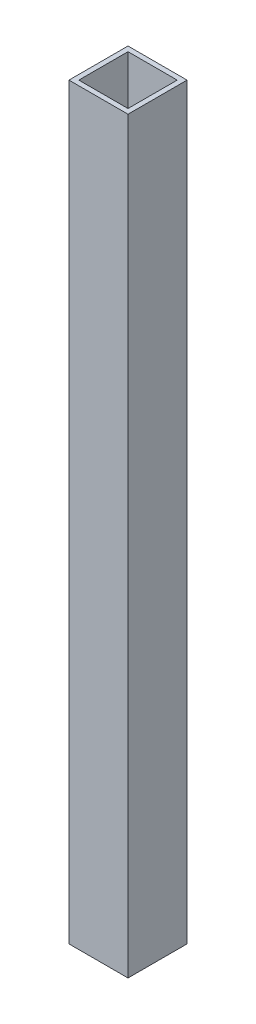
ISO-10303-21;
HEADER;
FILE_DESCRIPTION(('STEP AP214'),'2;1');
FILE_NAME('part.step','',(''),(''),'','','');
FILE_SCHEMA(('AUTOMOTIVE_DESIGN { 1 0 10303 214 1 1 1 1 }'));
ENDSEC;
DATA;
#1=APPLICATION_CONTEXT('core data for automotive mechanical design processes');
#2=APPLICATION_PROTOCOL_DEFINITION('international standard','automotive_design',2000,#1);
#3=PRODUCT_CONTEXT('',#1,'mechanical');
#4=PRODUCT('Part','Part','',(#3));
#5=PRODUCT_RELATED_PRODUCT_CATEGORY('part','',(#4));
#6=PRODUCT_DEFINITION_FORMATION('','',#4);
#7=PRODUCT_DEFINITION_CONTEXT('part definition',#1,'design');
#8=PRODUCT_DEFINITION('design','',#6,#7);
#9=PRODUCT_DEFINITION_SHAPE('','',#8);
#10=(LENGTH_UNIT() NAMED_UNIT(*) SI_UNIT(.MILLI.,.METRE.));
#11=(NAMED_UNIT(*) PLANE_ANGLE_UNIT() SI_UNIT($,.RADIAN.));
#12=(NAMED_UNIT(*) SI_UNIT($,.STERADIAN.) SOLID_ANGLE_UNIT());
#13=UNCERTAINTY_MEASURE_WITH_UNIT(LENGTH_MEASURE(1.E-05),#10,'distance_accuracy_value','');
#14=(GEOMETRIC_REPRESENTATION_CONTEXT(3) GLOBAL_UNCERTAINTY_ASSIGNED_CONTEXT((#13)) GLOBAL_UNIT_ASSIGNED_CONTEXT((#10,
#11,#12)) REPRESENTATION_CONTEXT('',''));
#15=CARTESIAN_POINT('',(0.,0.,0.));
#16=DIRECTION('',(0.,0.,1.));
#17=DIRECTION('',(1.,0.,0.));
#18=AXIS2_PLACEMENT_3D('',#15,#16,#17);
#19=CARTESIAN_POINT('',(0.,241.3,0.));
#20=DIRECTION('',(0.,-1.,0.));
#21=DIRECTION('',(0.,0.,-1.));
#22=AXIS2_PLACEMENT_3D('',#19,#20,#21);
#23=PLANE('',#22);
#24=DIRECTION('',(0.,0.,1.));
#25=VECTOR('',#24,1.);
#26=CARTESIAN_POINT('',(0.,241.3,0.));
#27=LINE('',#26,#25);
#28=CARTESIAN_POINT('',(0.,241.3,-19.05));
#29=VERTEX_POINT('',#28);
#30=CARTESIAN_POINT('',(0.,241.3,0.));
#31=VERTEX_POINT('',#30);
#32=EDGE_CURVE('E134',#29,#31,#27,.T.);
#33=ORIENTED_EDGE('',*,*,#32,.T.);
#34=DIRECTION('',(1.,0.,0.));
#35=VECTOR('',#34,1.);
#36=CARTESIAN_POINT('',(0.,241.3,0.));
#37=LINE('',#36,#35);
#38=CARTESIAN_POINT('',(19.05,241.3,0.));
#39=VERTEX_POINT('',#38);
#40=EDGE_CURVE('E137',#31,#39,#37,.T.);
#41=ORIENTED_EDGE('',*,*,#40,.T.);
#42=DIRECTION('',(0.,0.,-1.));
#43=VECTOR('',#42,1.);
#44=CARTESIAN_POINT('',(19.05,241.3,0.));
#45=LINE('',#44,#43);
#46=CARTESIAN_POINT('',(19.05,241.3,-19.05));
#47=VERTEX_POINT('',#46);
#48=EDGE_CURVE('E140',#39,#47,#45,.T.);
#49=ORIENTED_EDGE('',*,*,#48,.T.);
#50=DIRECTION('',(-1.,0.,0.));
#51=VECTOR('',#50,1.);
#52=CARTESIAN_POINT('',(0.,241.3,-19.05));
#53=LINE('',#52,#51);
#54=EDGE_CURVE('E142',#47,#29,#53,.T.);
#55=ORIENTED_EDGE('',*,*,#54,.T.);
#56=EDGE_LOOP('',(#33,#41,#49,#55));
#57=FACE_BOUND('',#56,.T.);
#58=DIRECTION('',(0.,0.,-1.));
#59=VECTOR('',#58,1.);
#60=CARTESIAN_POINT('',(17.4625,241.3,-1.5875));
#61=LINE('',#60,#59);
#62=CARTESIAN_POINT('',(17.4625,241.3,-1.5875));
#63=VERTEX_POINT('',#62);
#64=CARTESIAN_POINT('',(17.4625,241.3,-17.4625));
#65=VERTEX_POINT('',#64);
#66=EDGE_CURVE('E98',#63,#65,#61,.T.);
#67=ORIENTED_EDGE('',*,*,#66,.F.);
#68=DIRECTION('',(1.,0.,0.));
#69=VECTOR('',#68,1.);
#70=CARTESIAN_POINT('',(1.5875,241.3,-1.5875));
#71=LINE('',#70,#69);
#72=CARTESIAN_POINT('',(1.5875,241.3,-1.5875));
#73=VERTEX_POINT('',#72);
#74=EDGE_CURVE('E120',#73,#63,#71,.T.);
#75=ORIENTED_EDGE('',*,*,#74,.F.);
#76=DIRECTION('',(0.,0.,1.));
#77=VECTOR('',#76,1.);
#78=CARTESIAN_POINT('',(1.5875,241.3,-1.5875));
#79=LINE('',#78,#77);
#80=CARTESIAN_POINT('',(1.5875,241.3,-17.4625));
#81=VERTEX_POINT('',#80);
#82=EDGE_CURVE('E118',#81,#73,#79,.T.);
#83=ORIENTED_EDGE('',*,*,#82,.F.);
#84=DIRECTION('',(-1.,0.,0.));
#85=VECTOR('',#84,1.);
#86=CARTESIAN_POINT('',(1.5875,241.3,-17.4625));
#87=LINE('',#86,#85);
#88=EDGE_CURVE('E106',#65,#81,#87,.T.);
#89=ORIENTED_EDGE('',*,*,#88,.F.);
#90=EDGE_LOOP('',(#67,#75,#83,#89));
#91=FACE_BOUND('',#90,.T.);
#92=ADVANCED_FACE('F33',(#57,#91),#23,.F.);
#93=CARTESIAN_POINT('',(0.,0.,0.));
#94=DIRECTION('',(0.,-1.,0.));
#95=DIRECTION('',(0.,0.,-1.));
#96=AXIS2_PLACEMENT_3D('',#93,#94,#95);
#97=PLANE('',#96);
#98=DIRECTION('',(0.,0.,1.));
#99=VECTOR('',#98,1.);
#100=CARTESIAN_POINT('',(0.,0.,0.));
#101=LINE('',#100,#99);
#102=CARTESIAN_POINT('',(0.,0.,-19.05));
#103=VERTEX_POINT('',#102);
#104=CARTESIAN_POINT('',(0.,0.,0.));
#105=VERTEX_POINT('',#104);
#106=EDGE_CURVE('E114',#103,#105,#101,.T.);
#107=ORIENTED_EDGE('',*,*,#106,.F.);
#108=DIRECTION('',(-1.,0.,0.));
#109=VECTOR('',#108,1.);
#110=CARTESIAN_POINT('',(0.,0.,-19.05));
#111=LINE('',#110,#109);
#112=CARTESIAN_POINT('',(19.05,0.,-19.05));
#113=VERTEX_POINT('',#112);
#114=EDGE_CURVE('E138',#113,#103,#111,.T.);
#115=ORIENTED_EDGE('',*,*,#114,.F.);
#116=DIRECTION('',(0.,0.,-1.));
#117=VECTOR('',#116,1.);
#118=CARTESIAN_POINT('',(19.05,0.,0.));
#119=LINE('',#118,#117);
#120=CARTESIAN_POINT('',(19.05,0.,0.));
#121=VERTEX_POINT('',#120);
#122=EDGE_CURVE('E149',#121,#113,#119,.T.);
#123=ORIENTED_EDGE('',*,*,#122,.F.);
#124=DIRECTION('',(1.,0.,0.));
#125=VECTOR('',#124,1.);
#126=CARTESIAN_POINT('',(0.,0.,0.));
#127=LINE('',#126,#125);
#128=EDGE_CURVE('E147',#105,#121,#127,.T.);
#129=ORIENTED_EDGE('',*,*,#128,.F.);
#130=EDGE_LOOP('',(#107,#115,#123,#129));
#131=FACE_BOUND('',#130,.T.);
#132=DIRECTION('',(1.,0.,0.));
#133=VECTOR('',#132,1.);
#134=CARTESIAN_POINT('',(1.5875,0.,-1.5875));
#135=LINE('',#134,#133);
#136=CARTESIAN_POINT('',(1.5875,0.,-1.5875));
#137=VERTEX_POINT('',#136);
#138=CARTESIAN_POINT('',(17.4625,0.,-1.5875));
#139=VERTEX_POINT('',#138);
#140=EDGE_CURVE('E107',#137,#139,#135,.T.);
#141=ORIENTED_EDGE('',*,*,#140,.T.);
#142=DIRECTION('',(0.,0.,-1.));
#143=VECTOR('',#142,1.);
#144=CARTESIAN_POINT('',(17.4625,0.,-1.5875));
#145=LINE('',#144,#143);
#146=CARTESIAN_POINT('',(17.4625,0.,-17.4625));
#147=VERTEX_POINT('',#146);
#148=EDGE_CURVE('E56',#139,#147,#145,.T.);
#149=ORIENTED_EDGE('',*,*,#148,.T.);
#150=DIRECTION('',(-1.,0.,0.));
#151=VECTOR('',#150,1.);
#152=CARTESIAN_POINT('',(1.5875,0.,-17.4625));
#153=LINE('',#152,#151);
#154=CARTESIAN_POINT('',(1.5875,0.,-17.4625));
#155=VERTEX_POINT('',#154);
#156=EDGE_CURVE('E113',#147,#155,#153,.T.);
#157=ORIENTED_EDGE('',*,*,#156,.T.);
#158=DIRECTION('',(0.,0.,1.));
#159=VECTOR('',#158,1.);
#160=CARTESIAN_POINT('',(1.5875,0.,-1.5875));
#161=LINE('',#160,#159);
#162=EDGE_CURVE('E126',#155,#137,#161,.T.);
#163=ORIENTED_EDGE('',*,*,#162,.T.);
#164=EDGE_LOOP('',(#141,#149,#157,#163));
#165=FACE_BOUND('',#164,.T.);
#166=ADVANCED_FACE('F167',(#131,#165),#97,.T.);
#167=CARTESIAN_POINT('',(0.,241.3,0.));
#168=DIRECTION('',(1.,0.,0.));
#169=DIRECTION('',(0.,0.,-1.));
#170=AXIS2_PLACEMENT_3D('',#167,#168,#169);
#171=PLANE('',#170);
#172=ORIENTED_EDGE('',*,*,#106,.T.);
#173=DIRECTION('',(0.,-1.,0.));
#174=VECTOR('',#173,1.);
#175=CARTESIAN_POINT('',(0.,241.3,0.));
#176=LINE('',#175,#174);
#177=EDGE_CURVE('E11',#31,#105,#176,.T.);
#178=ORIENTED_EDGE('',*,*,#177,.F.);
#179=ORIENTED_EDGE('',*,*,#32,.F.);
#180=DIRECTION('',(0.,-1.,0.));
#181=VECTOR('',#180,1.);
#182=CARTESIAN_POINT('',(0.,241.3,-19.05));
#183=LINE('',#182,#181);
#184=EDGE_CURVE('E144',#29,#103,#183,.T.);
#185=ORIENTED_EDGE('',*,*,#184,.T.);
#186=EDGE_LOOP('',(#172,#178,#179,#185));
#187=FACE_BOUND('',#186,.T.);
#188=ADVANCED_FACE('F35',(#187),#171,.F.);
#189=CARTESIAN_POINT('',(0.,241.3,0.));
#190=DIRECTION('',(0.,0.,-1.));
#191=DIRECTION('',(-1.,0.,0.));
#192=AXIS2_PLACEMENT_3D('',#189,#190,#191);
#193=PLANE('',#192);
#194=ORIENTED_EDGE('',*,*,#128,.T.);
#195=DIRECTION('',(0.,-1.,0.));
#196=VECTOR('',#195,1.);
#197=CARTESIAN_POINT('',(19.05,241.3,0.));
#198=LINE('',#197,#196);
#199=EDGE_CURVE('E41',#39,#121,#198,.T.);
#200=ORIENTED_EDGE('',*,*,#199,.F.);
#201=ORIENTED_EDGE('',*,*,#40,.F.);
#202=ORIENTED_EDGE('',*,*,#177,.T.);
#203=EDGE_LOOP('',(#194,#200,#201,#202));
#204=FACE_BOUND('',#203,.T.);
#205=ADVANCED_FACE('F177',(#204),#193,.F.);
#206=CARTESIAN_POINT('',(19.05,241.3,0.));
#207=DIRECTION('',(-1.,0.,0.));
#208=DIRECTION('',(0.,0.,1.));
#209=AXIS2_PLACEMENT_3D('',#206,#207,#208);
#210=PLANE('',#209);
#211=ORIENTED_EDGE('',*,*,#122,.T.);
#212=DIRECTION('',(0.,-1.,0.));
#213=VECTOR('',#212,1.);
#214=CARTESIAN_POINT('',(19.05,241.3,-19.05));
#215=LINE('',#214,#213);
#216=EDGE_CURVE('E154',#47,#113,#215,.T.);
#217=ORIENTED_EDGE('',*,*,#216,.F.);
#218=ORIENTED_EDGE('',*,*,#48,.F.);
#219=ORIENTED_EDGE('',*,*,#199,.T.);
#220=EDGE_LOOP('',(#211,#217,#218,#219));
#221=FACE_BOUND('',#220,.T.);
#222=ADVANCED_FACE('F161',(#221),#210,.F.);
#223=CARTESIAN_POINT('',(0.,241.3,-19.05));
#224=DIRECTION('',(0.,0.,1.));
#225=DIRECTION('',(1.,0.,0.));
#226=AXIS2_PLACEMENT_3D('',#223,#224,#225);
#227=PLANE('',#226);
#228=ORIENTED_EDGE('',*,*,#114,.T.);
#229=ORIENTED_EDGE('',*,*,#184,.F.);
#230=ORIENTED_EDGE('',*,*,#54,.F.);
#231=ORIENTED_EDGE('',*,*,#216,.T.);
#232=EDGE_LOOP('',(#228,#229,#230,#231));
#233=FACE_BOUND('',#232,.T.);
#234=ADVANCED_FACE('F171',(#233),#227,.F.);
#235=CARTESIAN_POINT('',(17.4625,241.3,-1.5875));
#236=DIRECTION('',(-1.,0.,0.));
#237=DIRECTION('',(0.,0.,1.));
#238=AXIS2_PLACEMENT_3D('',#235,#236,#237);
#239=PLANE('',#238);
#240=ORIENTED_EDGE('',*,*,#148,.F.);
#241=DIRECTION('',(0.,-1.,0.));
#242=VECTOR('',#241,1.);
#243=CARTESIAN_POINT('',(17.4625,241.3,-1.5875));
#244=LINE('',#243,#242);
#245=EDGE_CURVE('E102',#63,#139,#244,.T.);
#246=ORIENTED_EDGE('',*,*,#245,.F.);
#247=ORIENTED_EDGE('',*,*,#66,.T.);
#248=DIRECTION('',(0.,-1.,0.));
#249=VECTOR('',#248,1.);
#250=CARTESIAN_POINT('',(17.4625,241.3,-17.4625));
#251=LINE('',#250,#249);
#252=EDGE_CURVE('E101',#65,#147,#251,.T.);
#253=ORIENTED_EDGE('',*,*,#252,.T.);
#254=EDGE_LOOP('',(#240,#246,#247,#253));
#255=FACE_BOUND('',#254,.T.);
#256=ADVANCED_FACE('F100',(#255),#239,.T.);
#257=CARTESIAN_POINT('',(1.5875,241.3,-17.4625));
#258=DIRECTION('',(0.,0.,1.));
#259=DIRECTION('',(1.,0.,0.));
#260=AXIS2_PLACEMENT_3D('',#257,#258,#259);
#261=PLANE('',#260);
#262=ORIENTED_EDGE('',*,*,#156,.F.);
#263=ORIENTED_EDGE('',*,*,#252,.F.);
#264=ORIENTED_EDGE('',*,*,#88,.T.);
#265=DIRECTION('',(0.,-1.,0.));
#266=VECTOR('',#265,1.);
#267=CARTESIAN_POINT('',(1.5875,241.3,-17.4625));
#268=LINE('',#267,#266);
#269=EDGE_CURVE('E115',#81,#155,#268,.T.);
#270=ORIENTED_EDGE('',*,*,#269,.T.);
#271=EDGE_LOOP('',(#262,#263,#264,#270));
#272=FACE_BOUND('',#271,.T.);
#273=ADVANCED_FACE('F110',(#272),#261,.T.);
#274=CARTESIAN_POINT('',(1.5875,241.3,-1.5875));
#275=DIRECTION('',(1.,0.,0.));
#276=DIRECTION('',(0.,0.,-1.));
#277=AXIS2_PLACEMENT_3D('',#274,#275,#276);
#278=PLANE('',#277);
#279=ORIENTED_EDGE('',*,*,#162,.F.);
#280=ORIENTED_EDGE('',*,*,#269,.F.);
#281=ORIENTED_EDGE('',*,*,#82,.T.);
#282=DIRECTION('',(0.,-1.,0.));
#283=VECTOR('',#282,1.);
#284=CARTESIAN_POINT('',(1.5875,241.3,-1.5875));
#285=LINE('',#284,#283);
#286=EDGE_CURVE('E48',#73,#137,#285,.T.);
#287=ORIENTED_EDGE('',*,*,#286,.T.);
#288=EDGE_LOOP('',(#279,#280,#281,#287));
#289=FACE_BOUND('',#288,.T.);
#290=ADVANCED_FACE('F200',(#289),#278,.T.);
#291=CARTESIAN_POINT('',(1.5875,241.3,-1.5875));
#292=DIRECTION('',(0.,0.,-1.));
#293=DIRECTION('',(-1.,0.,0.));
#294=AXIS2_PLACEMENT_3D('',#291,#292,#293);
#295=PLANE('',#294);
#296=ORIENTED_EDGE('',*,*,#140,.F.);
#297=ORIENTED_EDGE('',*,*,#286,.F.);
#298=ORIENTED_EDGE('',*,*,#74,.T.);
#299=ORIENTED_EDGE('',*,*,#245,.T.);
#300=EDGE_LOOP('',(#296,#297,#298,#299));
#301=FACE_BOUND('',#300,.T.);
#302=ADVANCED_FACE('F204',(#301),#295,.T.);
#303=CLOSED_SHELL('',(#92,#166,#188,#205,#222,#234,#256,#273,#290,#302));
#304=MANIFOLD_SOLID_BREP('B2',#303);
#305=ADVANCED_BREP_SHAPE_REPRESENTATION('',(#18,#304),#14);
#306=SHAPE_DEFINITION_REPRESENTATION(#9,#305);
ENDSEC;
END-ISO-10303-21;
